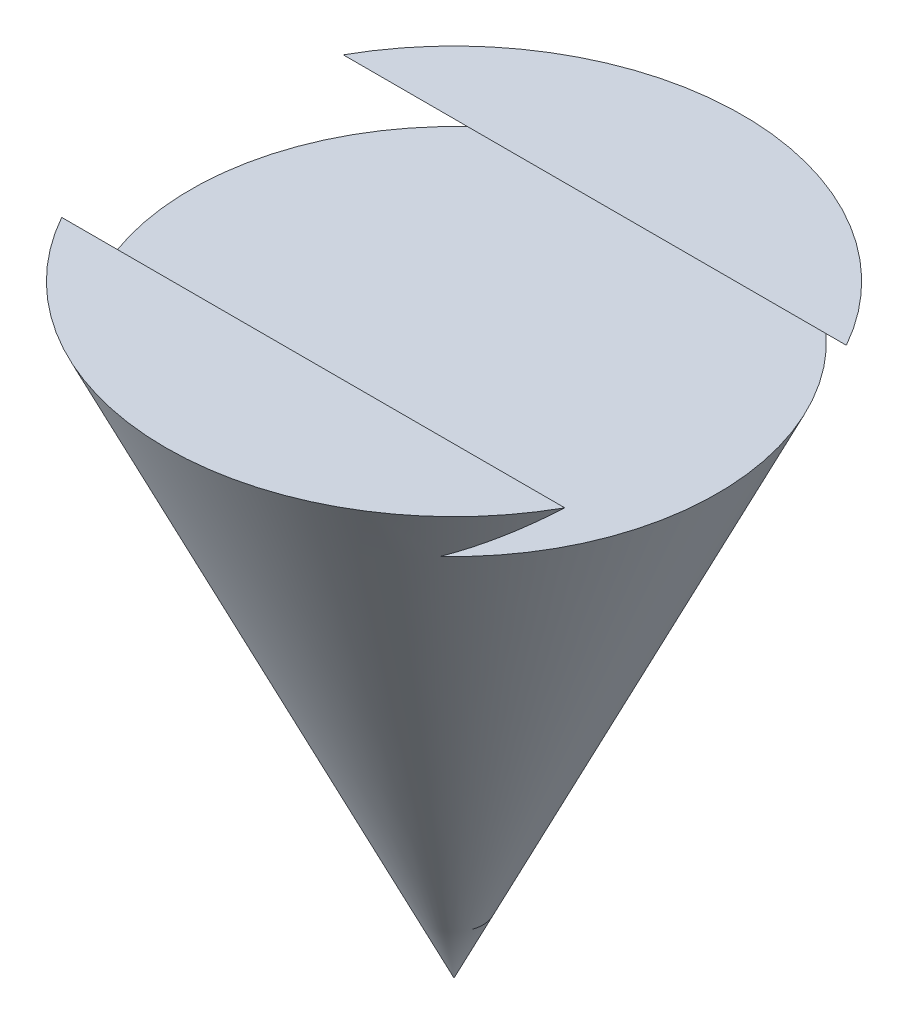
ISO-10303-21;
HEADER;
FILE_DESCRIPTION(('STEP AP214'),'2;1');
FILE_NAME('part.step','',(''),(''),'','','');
FILE_SCHEMA(('AUTOMOTIVE_DESIGN { 1 0 10303 214 1 1 1 1 }'));
ENDSEC;
DATA;
#1=APPLICATION_CONTEXT('core data for automotive mechanical design processes');
#2=APPLICATION_PROTOCOL_DEFINITION('international standard','automotive_design',2000,#1);
#3=PRODUCT_CONTEXT('',#1,'mechanical');
#4=PRODUCT('Part','Part','',(#3));
#5=PRODUCT_RELATED_PRODUCT_CATEGORY('part','',(#4));
#6=PRODUCT_DEFINITION_FORMATION('','',#4);
#7=PRODUCT_DEFINITION_CONTEXT('part definition',#1,'design');
#8=PRODUCT_DEFINITION('design','',#6,#7);
#9=PRODUCT_DEFINITION_SHAPE('','',#8);
#10=(LENGTH_UNIT() NAMED_UNIT(*) SI_UNIT(.MILLI.,.METRE.));
#11=(NAMED_UNIT(*) PLANE_ANGLE_UNIT() SI_UNIT($,.RADIAN.));
#12=(NAMED_UNIT(*) SI_UNIT($,.STERADIAN.) SOLID_ANGLE_UNIT());
#13=UNCERTAINTY_MEASURE_WITH_UNIT(LENGTH_MEASURE(1.E-05),#10,'distance_accuracy_value','');
#14=(GEOMETRIC_REPRESENTATION_CONTEXT(3) GLOBAL_UNCERTAINTY_ASSIGNED_CONTEXT((#13)) GLOBAL_UNIT_ASSIGNED_CONTEXT((#10,
#11,#12)) REPRESENTATION_CONTEXT('',''));
#15=CARTESIAN_POINT('',(0.,0.,0.));
#16=DIRECTION('',(0.,0.,1.));
#17=DIRECTION('',(1.,0.,0.));
#18=AXIS2_PLACEMENT_3D('',#15,#16,#17);
#19=CARTESIAN_POINT('',(0.,0.,-21.5));
#20=DIRECTION('',(0.,-1.,0.));
#21=DIRECTION('',(0.,0.,-1.));
#22=AXIS2_PLACEMENT_3D('',#19,#20,#21);
#23=PLANE('',#22);
#24=CARTESIAN_POINT('',(0.,0.,0.));
#25=DIRECTION('',(0.,1.,0.));
#26=DIRECTION('',(0.,0.,1.));
#27=AXIS2_PLACEMENT_3D('',#24,#25,#26);
#28=CIRCLE('',#27,21.5);
#29=CARTESIAN_POINT('',(18.7616630392937,0.,-10.5));
#30=VERTEX_POINT('',#29);
#31=CARTESIAN_POINT('',(-18.7616630392937,0.,-10.5));
#32=VERTEX_POINT('',#31);
#33=EDGE_CURVE('E99',#30,#32,#28,.T.);
#34=ORIENTED_EDGE('',*,*,#33,.T.);
#35=DIRECTION('',(1.,0.,0.));
#36=VECTOR('',#35,1.);
#37=CARTESIAN_POINT('',(-21.5,0.,-10.5));
#38=LINE('',#37,#36);
#39=EDGE_CURVE('E104',#32,#30,#38,.T.);
#40=ORIENTED_EDGE('',*,*,#39,.T.);
#41=EDGE_LOOP('',(#34,#40));
#42=FACE_BOUND('',#41,.T.);
#43=ADVANCED_FACE('F36',(#42),#23,.F.);
#44=CARTESIAN_POINT('',(-18.7616630392937,0.,10.5));
#45=VERTEX_POINT('',#44);
#46=CARTESIAN_POINT('',(18.7616630392937,0.,10.5));
#47=VERTEX_POINT('',#46);
#48=EDGE_CURVE('E95',#45,#47,#28,.T.);
#49=ORIENTED_EDGE('',*,*,#48,.T.);
#50=DIRECTION('',(1.,0.,0.));
#51=VECTOR('',#50,1.);
#52=CARTESIAN_POINT('',(-21.5,0.,10.5));
#53=LINE('',#52,#51);
#54=EDGE_CURVE('E52',#45,#47,#53,.T.);
#55=ORIENTED_EDGE('',*,*,#54,.F.);
#56=EDGE_LOOP('',(#49,#55));
#57=FACE_BOUND('',#56,.T.);
#58=ADVANCED_FACE('F38',(#57),#23,.F.);
#59=CARTESIAN_POINT('',(0.,-45.,0.));
#60=DIRECTION('',(0.,1.,0.));
#61=DIRECTION('',(0.,0.,1.));
#62=AXIS2_PLACEMENT_3D('',#59,#60,#61);
#63=CONICAL_SURFACE('',#62,0.,0.445712312628636);
#64=CARTESIAN_POINT('',(0.,-3.88908729652602,0.));
#65=DIRECTION('',(0.,-1.,0.));
#66=DIRECTION('',(0.,0.,-1.));
#67=AXIS2_PLACEMENT_3D('',#64,#65,#66);
#68=CIRCLE('',#67,19.641880513882);
#69=CARTESIAN_POINT('',(-13.3700275577342,-3.88908729652602,14.389087296526));
#70=VERTEX_POINT('',#69);
#71=CARTESIAN_POINT('',(-13.3700275577342,-3.88908729652602,-14.389087296526));
#72=VERTEX_POINT('',#71);
#73=EDGE_CURVE('E45',#70,#72,#68,.T.);
#74=ORIENTED_EDGE('',*,*,#73,.T.);
#75=CARTESIAN_POINT('',(0.,26.9164933610624,16.4164933610623));
#76=DIRECTION('',(0.,0.707106781186546,-0.707106781186549));
#77=DIRECTION('',(0.,0.707106781186549,0.707106781186546));
#78=AXIS2_PLACEMENT_3D('',#75,#76,#77);
#79=ELLIPSE('',#78,48.5925227954418,30.1846878655214);
#80=EDGE_CURVE('E11',#72,#32,#79,.T.);
#81=ORIENTED_EDGE('',*,*,#80,.T.);
#82=ORIENTED_EDGE('',*,*,#33,.F.);
#83=CARTESIAN_POINT('',(13.3700275577342,-3.88908729652602,-14.389087296526));
#84=VERTEX_POINT('',#83);
#85=EDGE_CURVE('E40',#30,#84,#79,.T.);
#86=ORIENTED_EDGE('',*,*,#85,.T.);
#87=CARTESIAN_POINT('',(13.3700275577342,-3.88908729652602,14.389087296526));
#88=VERTEX_POINT('',#87);
#89=EDGE_CURVE('E88',#84,#88,#68,.T.);
#90=ORIENTED_EDGE('',*,*,#89,.T.);
#91=CARTESIAN_POINT('',(0.,26.9164933610625,-16.4164933610624));
#92=DIRECTION('',(0.,0.707106781186546,0.707106781186549));
#93=DIRECTION('',(0.,0.707106781186549,-0.707106781186546));
#94=AXIS2_PLACEMENT_3D('',#91,#92,#93);
#95=ELLIPSE('',#94,48.5925227954418,30.1846878655215);
#96=EDGE_CURVE('E90',#88,#47,#95,.T.);
#97=ORIENTED_EDGE('',*,*,#96,.T.);
#98=ORIENTED_EDGE('',*,*,#48,.F.);
#99=EDGE_CURVE('E87',#45,#70,#95,.T.);
#100=ORIENTED_EDGE('',*,*,#99,.T.);
#101=EDGE_LOOP('',(#74,#81,#82,#86,#90,#97,#98,#100));
#102=FACE_BOUND('',#101,.T.);
#103=CARTESIAN_POINT('',(0.,-45.,0.));
#104=VERTEX_POINT('',#103);
#105=VERTEX_LOOP('',#104);
#106=FACE_BOUND('',#105,.T.);
#107=ADVANCED_FACE('F93',(#102,#106),#63,.T.);
#108=CARTESIAN_POINT('',(-21.5,-3.88908729652602,-14.389087296526));
#109=DIRECTION('',(0.,0.707106781186546,-0.707106781186549));
#110=DIRECTION('',(0.,0.707106781186549,0.707106781186546));
#111=AXIS2_PLACEMENT_3D('',#108,#109,#110);
#112=PLANE('',#111);
#113=ORIENTED_EDGE('',*,*,#39,.F.);
#114=ORIENTED_EDGE('',*,*,#80,.F.);
#115=DIRECTION('',(1.,0.,0.));
#116=VECTOR('',#115,1.);
#117=CARTESIAN_POINT('',(-21.5,-3.88908729652602,-14.389087296526));
#118=LINE('',#117,#116);
#119=EDGE_CURVE('E84',#72,#84,#118,.T.);
#120=ORIENTED_EDGE('',*,*,#119,.T.);
#121=ORIENTED_EDGE('',*,*,#85,.F.);
#122=EDGE_LOOP('',(#113,#114,#120,#121));
#123=FACE_BOUND('',#122,.T.);
#124=ADVANCED_FACE('F109',(#123),#112,.F.);
#125=CARTESIAN_POINT('',(-21.5,-3.88908729652602,14.389087296526));
#126=DIRECTION('',(0.,-1.,0.));
#127=DIRECTION('',(0.,0.,-1.));
#128=AXIS2_PLACEMENT_3D('',#125,#126,#127);
#129=PLANE('',#128);
#130=ORIENTED_EDGE('',*,*,#119,.F.);
#131=ORIENTED_EDGE('',*,*,#73,.F.);
#132=DIRECTION('',(1.,0.,0.));
#133=VECTOR('',#132,1.);
#134=CARTESIAN_POINT('',(-21.5,-3.88908729652602,14.389087296526));
#135=LINE('',#134,#133);
#136=EDGE_CURVE('E81',#70,#88,#135,.T.);
#137=ORIENTED_EDGE('',*,*,#136,.T.);
#138=ORIENTED_EDGE('',*,*,#89,.F.);
#139=EDGE_LOOP('',(#130,#131,#137,#138));
#140=FACE_BOUND('',#139,.T.);
#141=ADVANCED_FACE('F80',(#140),#129,.F.);
#142=CARTESIAN_POINT('',(-21.5,0.,10.5));
#143=DIRECTION('',(0.,0.707106781186546,0.707106781186549));
#144=DIRECTION('',(0.,-0.707106781186549,0.707106781186546));
#145=AXIS2_PLACEMENT_3D('',#142,#143,#144);
#146=PLANE('',#145);
#147=ORIENTED_EDGE('',*,*,#54,.T.);
#148=ORIENTED_EDGE('',*,*,#96,.F.);
#149=ORIENTED_EDGE('',*,*,#136,.F.);
#150=ORIENTED_EDGE('',*,*,#99,.F.);
#151=EDGE_LOOP('',(#147,#148,#149,#150));
#152=FACE_BOUND('',#151,.T.);
#153=ADVANCED_FACE('F89',(#152),#146,.F.);
#154=CLOSED_SHELL('',(#43,#58,#107,#124,#141,#153));
#155=MANIFOLD_SOLID_BREP('B2',#154);
#156=ADVANCED_BREP_SHAPE_REPRESENTATION('',(#18,#155),#14);
#157=SHAPE_DEFINITION_REPRESENTATION(#9,#156);
ENDSEC;
END-ISO-10303-21;
